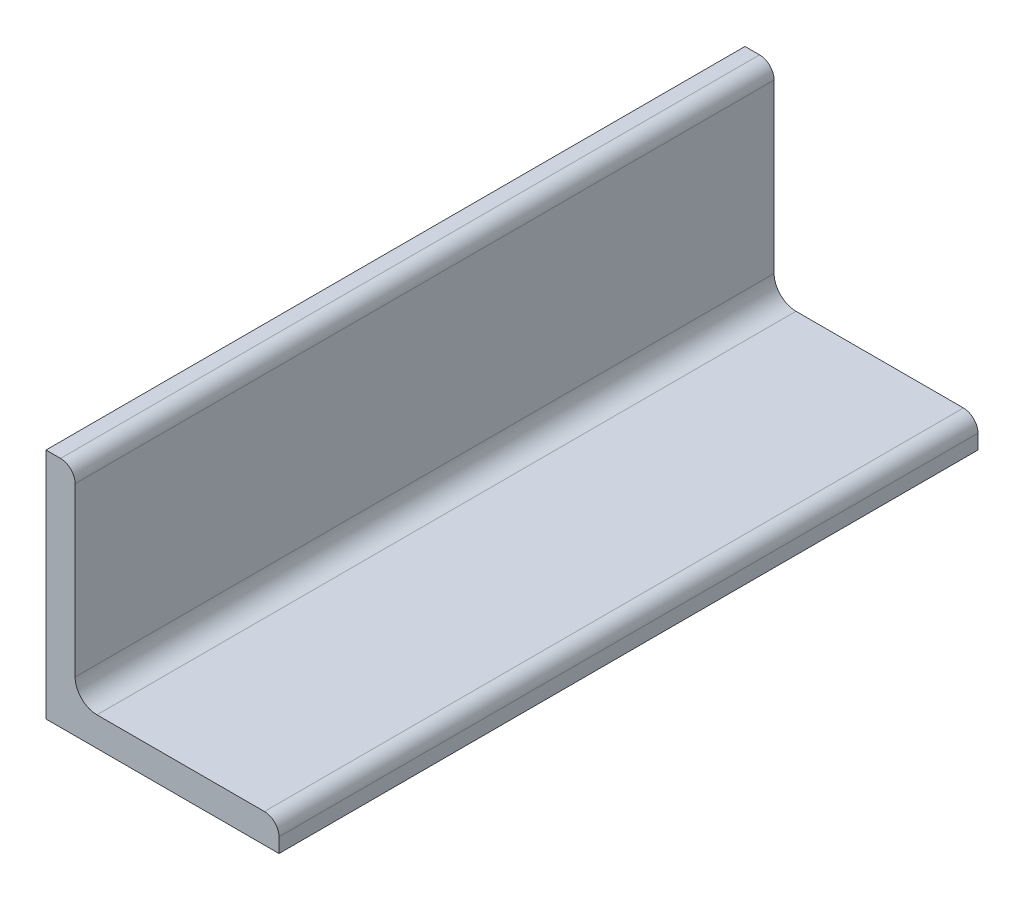
ISO-10303-21;
HEADER;
FILE_DESCRIPTION(('STEP AP214'),'2;1');
FILE_NAME('part.step','',(''),(''),'','','');
FILE_SCHEMA(('AUTOMOTIVE_DESIGN { 1 0 10303 214 1 1 1 1 }'));
ENDSEC;
DATA;
#1=APPLICATION_CONTEXT('core data for automotive mechanical design processes');
#2=APPLICATION_PROTOCOL_DEFINITION('international standard','automotive_design',2000,#1);
#3=PRODUCT_CONTEXT('',#1,'mechanical');
#4=PRODUCT('Part','Part','',(#3));
#5=PRODUCT_RELATED_PRODUCT_CATEGORY('part','',(#4));
#6=PRODUCT_DEFINITION_FORMATION('','',#4);
#7=PRODUCT_DEFINITION_CONTEXT('part definition',#1,'design');
#8=PRODUCT_DEFINITION('design','',#6,#7);
#9=PRODUCT_DEFINITION_SHAPE('','',#8);
#10=(LENGTH_UNIT() NAMED_UNIT(*) SI_UNIT(.MILLI.,.METRE.));
#11=(NAMED_UNIT(*) PLANE_ANGLE_UNIT() SI_UNIT($,.RADIAN.));
#12=(NAMED_UNIT(*) SI_UNIT($,.STERADIAN.) SOLID_ANGLE_UNIT());
#13=UNCERTAINTY_MEASURE_WITH_UNIT(LENGTH_MEASURE(1.E-05),#10,'distance_accuracy_value','');
#14=(GEOMETRIC_REPRESENTATION_CONTEXT(3) GLOBAL_UNCERTAINTY_ASSIGNED_CONTEXT((#13)) GLOBAL_UNIT_ASSIGNED_CONTEXT((#10,
#11,#12)) REPRESENTATION_CONTEXT('',''));
#15=CARTESIAN_POINT('',(0.,0.,0.));
#16=DIRECTION('',(0.,0.,1.));
#17=DIRECTION('',(1.,0.,0.));
#18=AXIS2_PLACEMENT_3D('',#15,#16,#17);
#19=CARTESIAN_POINT('',(0.865045893659089,102.172018782971,304.8));
#20=DIRECTION('',(1.,0.,0.));
#21=DIRECTION('',(0.,0.,-1.));
#22=AXIS2_PLACEMENT_3D('',#19,#20,#21);
#23=PLANE('',#22);
#24=DIRECTION('',(0.,-1.,0.));
#25=VECTOR('',#24,1.);
#26=CARTESIAN_POINT('',(0.865045893659089,102.172018782971,0.));
#27=LINE('',#26,#25);
#28=CARTESIAN_POINT('',(0.865045893659089,102.172018782971,0.));
#29=VERTEX_POINT('',#28);
#30=CARTESIAN_POINT('',(0.865045893659089,0.572018782971054,0.));
#31=VERTEX_POINT('',#30);
#32=EDGE_CURVE('E135',#29,#31,#27,.T.);
#33=ORIENTED_EDGE('',*,*,#32,.T.);
#34=DIRECTION('',(0.,0.,-1.));
#35=VECTOR('',#34,1.);
#36=CARTESIAN_POINT('',(0.865045893659089,0.572018782971054,304.8));
#37=LINE('',#36,#35);
#38=CARTESIAN_POINT('',(0.865045893659089,0.572018782971054,304.8));
#39=VERTEX_POINT('',#38);
#40=EDGE_CURVE('E11',#39,#31,#37,.T.);
#41=ORIENTED_EDGE('',*,*,#40,.F.);
#42=DIRECTION('',(0.,-1.,0.));
#43=VECTOR('',#42,1.);
#44=CARTESIAN_POINT('',(0.865045893659089,102.172018782971,304.8));
#45=LINE('',#44,#43);
#46=CARTESIAN_POINT('',(0.865045893659089,102.172018782971,304.8));
#47=VERTEX_POINT('',#46);
#48=EDGE_CURVE('E151',#47,#39,#45,.T.);
#49=ORIENTED_EDGE('',*,*,#48,.F.);
#50=DIRECTION('',(0.,0.,-1.));
#51=VECTOR('',#50,1.);
#52=CARTESIAN_POINT('',(0.865045893659089,102.172018782971,304.8));
#53=LINE('',#52,#51);
#54=EDGE_CURVE('E131',#47,#29,#53,.T.);
#55=ORIENTED_EDGE('',*,*,#54,.T.);
#56=EDGE_LOOP('',(#33,#41,#49,#55));
#57=FACE_BOUND('',#56,.T.);
#58=ADVANCED_FACE('F33',(#57),#23,.F.);
#59=CARTESIAN_POINT('',(0.865045893659089,0.572018782971054,304.8));
#60=DIRECTION('',(0.,1.,0.));
#61=DIRECTION('',(0.,0.,1.));
#62=AXIS2_PLACEMENT_3D('',#59,#60,#61);
#63=PLANE('',#62);
#64=DIRECTION('',(1.,0.,0.));
#65=VECTOR('',#64,1.);
#66=CARTESIAN_POINT('',(0.865045893659089,0.572018782971054,0.));
#67=LINE('',#66,#65);
#68=CARTESIAN_POINT('',(102.465045893659,0.572018782971054,0.));
#69=VERTEX_POINT('',#68);
#70=EDGE_CURVE('E138',#31,#69,#67,.T.);
#71=ORIENTED_EDGE('',*,*,#70,.T.);
#72=DIRECTION('',(0.,0.,-1.));
#73=VECTOR('',#72,1.);
#74=CARTESIAN_POINT('',(102.465045893659,0.572018782971054,304.8));
#75=LINE('',#74,#73);
#76=CARTESIAN_POINT('',(102.465045893659,0.572018782971054,304.8));
#77=VERTEX_POINT('',#76);
#78=EDGE_CURVE('E41',#77,#69,#75,.T.);
#79=ORIENTED_EDGE('',*,*,#78,.F.);
#80=DIRECTION('',(1.,0.,0.));
#81=VECTOR('',#80,1.);
#82=CARTESIAN_POINT('',(0.865045893659089,0.572018782971054,304.8));
#83=LINE('',#82,#81);
#84=EDGE_CURVE('E95',#39,#77,#83,.T.);
#85=ORIENTED_EDGE('',*,*,#84,.F.);
#86=ORIENTED_EDGE('',*,*,#40,.T.);
#87=EDGE_LOOP('',(#71,#79,#85,#86));
#88=FACE_BOUND('',#87,.T.);
#89=ADVANCED_FACE('F194',(#88),#63,.F.);
#90=CARTESIAN_POINT('',(102.465045893659,0.572018782971054,304.8));
#91=DIRECTION('',(-1.,0.,0.));
#92=DIRECTION('',(0.,0.,1.));
#93=AXIS2_PLACEMENT_3D('',#90,#91,#92);
#94=PLANE('',#93);
#95=DIRECTION('',(0.,1.,0.));
#96=VECTOR('',#95,1.);
#97=CARTESIAN_POINT('',(102.465045893659,0.572018782971054,0.));
#98=LINE('',#97,#96);
#99=CARTESIAN_POINT('',(102.465045893659,6.92201878297105,0.));
#100=VERTEX_POINT('',#99);
#101=EDGE_CURVE('E140',#69,#100,#98,.T.);
#102=ORIENTED_EDGE('',*,*,#101,.T.);
#103=DIRECTION('',(0.,0.,-1.));
#104=VECTOR('',#103,1.);
#105=CARTESIAN_POINT('',(102.465045893659,6.92201878297105,304.8));
#106=LINE('',#105,#104);
#107=CARTESIAN_POINT('',(102.465045893659,6.92201878297105,304.8));
#108=VERTEX_POINT('',#107);
#109=EDGE_CURVE('E161',#108,#100,#106,.T.);
#110=ORIENTED_EDGE('',*,*,#109,.F.);
#111=DIRECTION('',(0.,1.,0.));
#112=VECTOR('',#111,1.);
#113=CARTESIAN_POINT('',(102.465045893659,0.572018782971054,304.8));
#114=LINE('',#113,#112);
#115=EDGE_CURVE('E169',#77,#108,#114,.T.);
#116=ORIENTED_EDGE('',*,*,#115,.F.);
#117=ORIENTED_EDGE('',*,*,#78,.T.);
#118=EDGE_LOOP('',(#102,#110,#116,#117));
#119=FACE_BOUND('',#118,.T.);
#120=ADVANCED_FACE('F167',(#119),#94,.F.);
#121=CARTESIAN_POINT('',(96.1150458936591,6.92201878297105,304.8));
#122=DIRECTION('',(0.,0.,-1.));
#123=DIRECTION('',(-1.,0.,0.));
#124=AXIS2_PLACEMENT_3D('',#121,#122,#123);
#125=CYLINDRICAL_SURFACE('',#124,6.35);
#126=CARTESIAN_POINT('',(96.1150458936591,6.92201878297105,0.));
#127=DIRECTION('',(0.,0.,1.));
#128=DIRECTION('',(1.,0.,0.));
#129=AXIS2_PLACEMENT_3D('',#126,#127,#128);
#130=CIRCLE('',#129,6.35);
#131=CARTESIAN_POINT('',(96.1150458936591,13.2720187829711,0.));
#132=VERTEX_POINT('',#131);
#133=EDGE_CURVE('E142',#100,#132,#130,.T.);
#134=ORIENTED_EDGE('',*,*,#133,.T.);
#135=DIRECTION('',(0.,0.,-1.));
#136=VECTOR('',#135,1.);
#137=CARTESIAN_POINT('',(96.1150458936591,13.2720187829711,304.8));
#138=LINE('',#137,#136);
#139=CARTESIAN_POINT('',(96.1150458936591,13.2720187829711,304.8));
#140=VERTEX_POINT('',#139);
#141=EDGE_CURVE('E158',#140,#132,#138,.T.);
#142=ORIENTED_EDGE('',*,*,#141,.F.);
#143=CARTESIAN_POINT('',(96.1150458936591,6.92201878297105,304.8));
#144=DIRECTION('',(0.,0.,1.));
#145=DIRECTION('',(1.,0.,0.));
#146=AXIS2_PLACEMENT_3D('',#143,#144,#145);
#147=CIRCLE('',#146,6.35);
#148=EDGE_CURVE('E185',#108,#140,#147,.T.);
#149=ORIENTED_EDGE('',*,*,#148,.F.);
#150=ORIENTED_EDGE('',*,*,#109,.T.);
#151=EDGE_LOOP('',(#134,#142,#149,#150));
#152=FACE_BOUND('',#151,.T.);
#153=ADVANCED_FACE('F178',(#152),#125,.T.);
#154=CARTESIAN_POINT('',(96.1150458936591,13.2720187829711,304.8));
#155=DIRECTION('',(0.,-1.,0.));
#156=DIRECTION('',(0.,0.,-1.));
#157=AXIS2_PLACEMENT_3D('',#154,#155,#156);
#158=PLANE('',#157);
#159=DIRECTION('',(-1.,0.,0.));
#160=VECTOR('',#159,1.);
#161=CARTESIAN_POINT('',(96.1150458936591,13.2720187829711,0.));
#162=LINE('',#161,#160);
#163=CARTESIAN_POINT('',(23.0900458936591,13.2720187829711,0.));
#164=VERTEX_POINT('',#163);
#165=EDGE_CURVE('E144',#132,#164,#162,.T.);
#166=ORIENTED_EDGE('',*,*,#165,.T.);
#167=DIRECTION('',(0.,0.,-1.));
#168=VECTOR('',#167,1.);
#169=CARTESIAN_POINT('',(23.0900458936591,13.2720187829711,304.8));
#170=LINE('',#169,#168);
#171=CARTESIAN_POINT('',(23.0900458936591,13.2720187829711,304.8));
#172=VERTEX_POINT('',#171);
#173=EDGE_CURVE('E155',#172,#164,#170,.T.);
#174=ORIENTED_EDGE('',*,*,#173,.F.);
#175=DIRECTION('',(-1.,0.,0.));
#176=VECTOR('',#175,1.);
#177=CARTESIAN_POINT('',(96.1150458936591,13.2720187829711,304.8));
#178=LINE('',#177,#176);
#179=EDGE_CURVE('E184',#140,#172,#178,.T.);
#180=ORIENTED_EDGE('',*,*,#179,.F.);
#181=ORIENTED_EDGE('',*,*,#141,.T.);
#182=EDGE_LOOP('',(#166,#174,#180,#181));
#183=FACE_BOUND('',#182,.T.);
#184=ADVANCED_FACE('F182',(#183),#158,.F.);
#185=CARTESIAN_POINT('',(23.0900458936591,22.797018782971,304.8));
#186=DIRECTION('',(0.,0.,-1.));
#187=DIRECTION('',(-1.,0.,0.));
#188=AXIS2_PLACEMENT_3D('',#185,#186,#187);
#189=CYLINDRICAL_SURFACE('',#188,9.52499999999999);
#190=CARTESIAN_POINT('',(23.0900458936591,22.797018782971,0.));
#191=DIRECTION('',(0.,0.,-1.));
#192=DIRECTION('',(1.,0.,0.));
#193=AXIS2_PLACEMENT_3D('',#190,#191,#192);
#194=CIRCLE('',#193,9.52499999999999);
#195=CARTESIAN_POINT('',(13.5650458936591,22.7970187829711,0.));
#196=VERTEX_POINT('',#195);
#197=EDGE_CURVE('E146',#164,#196,#194,.T.);
#198=ORIENTED_EDGE('',*,*,#197,.T.);
#199=DIRECTION('',(0.,0.,-1.));
#200=VECTOR('',#199,1.);
#201=CARTESIAN_POINT('',(13.5650458936591,22.7970187829711,304.8));
#202=LINE('',#201,#200);
#203=CARTESIAN_POINT('',(13.5650458936591,22.7970187829711,304.8));
#204=VERTEX_POINT('',#203);
#205=EDGE_CURVE('E126',#204,#196,#202,.T.);
#206=ORIENTED_EDGE('',*,*,#205,.F.);
#207=CARTESIAN_POINT('',(23.0900458936591,22.797018782971,304.8));
#208=DIRECTION('',(0.,0.,-1.));
#209=DIRECTION('',(1.,0.,0.));
#210=AXIS2_PLACEMENT_3D('',#207,#208,#209);
#211=CIRCLE('',#210,9.52499999999999);
#212=EDGE_CURVE('E117',#172,#204,#211,.T.);
#213=ORIENTED_EDGE('',*,*,#212,.F.);
#214=ORIENTED_EDGE('',*,*,#173,.T.);
#215=EDGE_LOOP('',(#198,#206,#213,#214));
#216=FACE_BOUND('',#215,.T.);
#217=ADVANCED_FACE('F206',(#216),#189,.F.);
#218=CARTESIAN_POINT('',(13.5650458936591,22.7970187829711,304.8));
#219=DIRECTION('',(-1.,0.,0.));
#220=DIRECTION('',(0.,0.,1.));
#221=AXIS2_PLACEMENT_3D('',#218,#219,#220);
#222=PLANE('',#221);
#223=DIRECTION('',(0.,1.,0.));
#224=VECTOR('',#223,1.);
#225=CARTESIAN_POINT('',(13.5650458936591,22.7970187829711,0.));
#226=LINE('',#225,#224);
#227=CARTESIAN_POINT('',(13.5650458936591,95.822018782971,0.));
#228=VERTEX_POINT('',#227);
#229=EDGE_CURVE('E125',#196,#228,#226,.T.);
#230=ORIENTED_EDGE('',*,*,#229,.T.);
#231=DIRECTION('',(0.,0.,-1.));
#232=VECTOR('',#231,1.);
#233=CARTESIAN_POINT('',(13.5650458936591,95.822018782971,304.8));
#234=LINE('',#233,#232);
#235=CARTESIAN_POINT('',(13.5650458936591,95.822018782971,304.8));
#236=VERTEX_POINT('',#235);
#237=EDGE_CURVE('E122',#236,#228,#234,.T.);
#238=ORIENTED_EDGE('',*,*,#237,.F.);
#239=DIRECTION('',(0.,1.,0.));
#240=VECTOR('',#239,1.);
#241=CARTESIAN_POINT('',(13.5650458936591,22.7970187829711,304.8));
#242=LINE('',#241,#240);
#243=EDGE_CURVE('E111',#204,#236,#242,.T.);
#244=ORIENTED_EDGE('',*,*,#243,.F.);
#245=ORIENTED_EDGE('',*,*,#205,.T.);
#246=EDGE_LOOP('',(#230,#238,#244,#245));
#247=FACE_BOUND('',#246,.T.);
#248=ADVANCED_FACE('F123',(#247),#222,.F.);
#249=CARTESIAN_POINT('',(7.21504589365909,95.822018782971,304.8));
#250=DIRECTION('',(0.,0.,-1.));
#251=DIRECTION('',(-1.,0.,0.));
#252=AXIS2_PLACEMENT_3D('',#249,#250,#251);
#253=CYLINDRICAL_SURFACE('',#252,6.35);
#254=CARTESIAN_POINT('',(7.21504589365909,95.822018782971,0.));
#255=DIRECTION('',(0.,0.,1.));
#256=DIRECTION('',(1.,0.,0.));
#257=AXIS2_PLACEMENT_3D('',#254,#255,#256);
#258=CIRCLE('',#257,6.35);
#259=CARTESIAN_POINT('',(7.21504589365909,102.172018782971,0.));
#260=VERTEX_POINT('',#259);
#261=EDGE_CURVE('E81',#228,#260,#258,.T.);
#262=ORIENTED_EDGE('',*,*,#261,.T.);
#263=DIRECTION('',(0.,0.,-1.));
#264=VECTOR('',#263,1.);
#265=CARTESIAN_POINT('',(7.21504589365909,102.172018782971,304.8));
#266=LINE('',#265,#264);
#267=CARTESIAN_POINT('',(7.21504589365909,102.172018782971,304.8));
#268=VERTEX_POINT('',#267);
#269=EDGE_CURVE('E127',#268,#260,#266,.T.);
#270=ORIENTED_EDGE('',*,*,#269,.F.);
#271=CARTESIAN_POINT('',(7.21504589365909,95.822018782971,304.8));
#272=DIRECTION('',(0.,0.,1.));
#273=DIRECTION('',(1.,0.,0.));
#274=AXIS2_PLACEMENT_3D('',#271,#272,#273);
#275=CIRCLE('',#274,6.35);
#276=EDGE_CURVE('E115',#236,#268,#275,.T.);
#277=ORIENTED_EDGE('',*,*,#276,.F.);
#278=ORIENTED_EDGE('',*,*,#237,.T.);
#279=EDGE_LOOP('',(#262,#270,#277,#278));
#280=FACE_BOUND('',#279,.T.);
#281=ADVANCED_FACE('F129',(#280),#253,.T.);
#282=CARTESIAN_POINT('',(7.21504589365909,102.172018782971,304.8));
#283=DIRECTION('',(0.,-1.,0.));
#284=DIRECTION('',(0.,0.,-1.));
#285=AXIS2_PLACEMENT_3D('',#282,#283,#284);
#286=PLANE('',#285);
#287=DIRECTION('',(-1.,0.,0.));
#288=VECTOR('',#287,1.);
#289=CARTESIAN_POINT('',(7.21504589365909,102.172018782971,0.));
#290=LINE('',#289,#288);
#291=EDGE_CURVE('E87',#260,#29,#290,.T.);
#292=ORIENTED_EDGE('',*,*,#291,.T.);
#293=ORIENTED_EDGE('',*,*,#54,.F.);
#294=DIRECTION('',(-1.,0.,0.));
#295=VECTOR('',#294,1.);
#296=CARTESIAN_POINT('',(7.21504589365909,102.172018782971,304.8));
#297=LINE('',#296,#295);
#298=EDGE_CURVE('E49',#268,#47,#297,.T.);
#299=ORIENTED_EDGE('',*,*,#298,.F.);
#300=ORIENTED_EDGE('',*,*,#269,.T.);
#301=EDGE_LOOP('',(#292,#293,#299,#300));
#302=FACE_BOUND('',#301,.T.);
#303=ADVANCED_FACE('F214',(#302),#286,.F.);
#304=CARTESIAN_POINT('',(96.1150458936591,6.92201878297105,304.8));
#305=DIRECTION('',(0.,0.,1.));
#306=DIRECTION('',(1.,0.,0.));
#307=AXIS2_PLACEMENT_3D('',#304,#305,#306);
#308=PLANE('',#307);
#309=ORIENTED_EDGE('',*,*,#48,.T.);
#310=ORIENTED_EDGE('',*,*,#84,.T.);
#311=ORIENTED_EDGE('',*,*,#115,.T.);
#312=ORIENTED_EDGE('',*,*,#148,.T.);
#313=ORIENTED_EDGE('',*,*,#179,.T.);
#314=ORIENTED_EDGE('',*,*,#212,.T.);
#315=ORIENTED_EDGE('',*,*,#243,.T.);
#316=ORIENTED_EDGE('',*,*,#276,.T.);
#317=ORIENTED_EDGE('',*,*,#298,.T.);
#318=EDGE_LOOP('',(#309,#310,#311,#312,#313,#314,#315,#316,#317));
#319=FACE_BOUND('',#318,.T.);
#320=ADVANCED_FACE('F113',(#319),#308,.T.);
#321=CARTESIAN_POINT('',(96.1150458936591,6.92201878297105,0.));
#322=DIRECTION('',(0.,0.,1.));
#323=DIRECTION('',(1.,0.,0.));
#324=AXIS2_PLACEMENT_3D('',#321,#322,#323);
#325=PLANE('',#324);
#326=ORIENTED_EDGE('',*,*,#32,.F.);
#327=ORIENTED_EDGE('',*,*,#291,.F.);
#328=ORIENTED_EDGE('',*,*,#261,.F.);
#329=ORIENTED_EDGE('',*,*,#229,.F.);
#330=ORIENTED_EDGE('',*,*,#197,.F.);
#331=ORIENTED_EDGE('',*,*,#165,.F.);
#332=ORIENTED_EDGE('',*,*,#133,.F.);
#333=ORIENTED_EDGE('',*,*,#101,.F.);
#334=ORIENTED_EDGE('',*,*,#70,.F.);
#335=EDGE_LOOP('',(#326,#327,#328,#329,#330,#331,#332,#333,#334));
#336=FACE_BOUND('',#335,.T.);
#337=ADVANCED_FACE('F173',(#336),#325,.F.);
#338=CLOSED_SHELL('',(#58,#89,#120,#153,#184,#217,#248,#281,#303,#320,#337));
#339=MANIFOLD_SOLID_BREP('B2',#338);
#340=ADVANCED_BREP_SHAPE_REPRESENTATION('',(#18,#339),#14);
#341=SHAPE_DEFINITION_REPRESENTATION(#9,#340);
ENDSEC;
END-ISO-10303-21;
